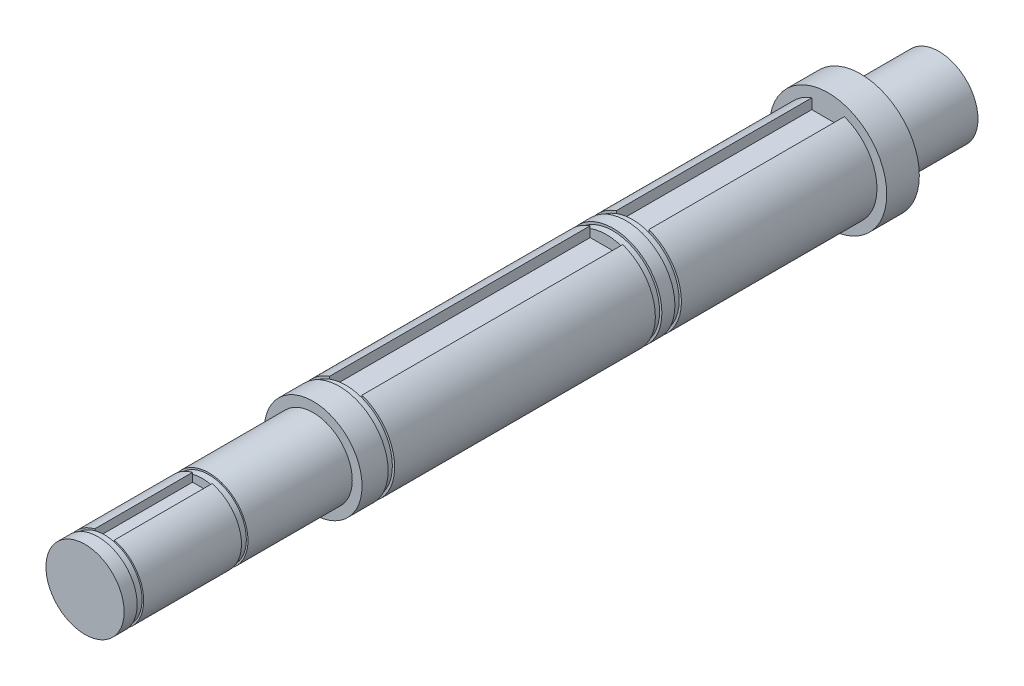
ISO-10303-21;
HEADER;
FILE_DESCRIPTION(('STEP AP214'),'2;1');
FILE_NAME('part.step','',(''),(''),'','','');
FILE_SCHEMA(('AUTOMOTIVE_DESIGN { 1 0 10303 214 1 1 1 1 }'));
ENDSEC;
DATA;
#1=APPLICATION_CONTEXT('core data for automotive mechanical design processes');
#2=APPLICATION_PROTOCOL_DEFINITION('international standard','automotive_design',2000,#1);
#3=PRODUCT_CONTEXT('',#1,'mechanical');
#4=PRODUCT('Part','Part','',(#3));
#5=PRODUCT_RELATED_PRODUCT_CATEGORY('part','',(#4));
#6=PRODUCT_DEFINITION_FORMATION('','',#4);
#7=PRODUCT_DEFINITION_CONTEXT('part definition',#1,'design');
#8=PRODUCT_DEFINITION('design','',#6,#7);
#9=PRODUCT_DEFINITION_SHAPE('','',#8);
#10=(LENGTH_UNIT() NAMED_UNIT(*) SI_UNIT(.MILLI.,.METRE.));
#11=(NAMED_UNIT(*) PLANE_ANGLE_UNIT() SI_UNIT($,.RADIAN.));
#12=(NAMED_UNIT(*) SI_UNIT($,.STERADIAN.) SOLID_ANGLE_UNIT());
#13=UNCERTAINTY_MEASURE_WITH_UNIT(LENGTH_MEASURE(1.E-05),#10,'distance_accuracy_value','');
#14=(GEOMETRIC_REPRESENTATION_CONTEXT(3) GLOBAL_UNCERTAINTY_ASSIGNED_CONTEXT((#13)) GLOBAL_UNIT_ASSIGNED_CONTEXT((#10,
#11,#12)) REPRESENTATION_CONTEXT('',''));
#15=CARTESIAN_POINT('',(0.,0.,0.));
#16=DIRECTION('',(0.,0.,1.));
#17=DIRECTION('',(1.,0.,0.));
#18=AXIS2_PLACEMENT_3D('',#15,#16,#17);
#19=CARTESIAN_POINT('',(0.,0.,0.));
#20=DIRECTION('',(0.,0.,1.));
#21=DIRECTION('',(1.,0.,0.));
#22=AXIS2_PLACEMENT_3D('',#19,#20,#21);
#23=CYLINDRICAL_SURFACE('',#22,6.);
#24=CARTESIAN_POINT('',(0.,0.,-12.));
#25=DIRECTION('',(0.,0.,1.));
#26=DIRECTION('',(1.,0.,0.));
#27=AXIS2_PLACEMENT_3D('',#24,#25,#26);
#28=CIRCLE('',#27,6.);
#29=CARTESIAN_POINT('',(6.,0.,-12.));
#30=VERTEX_POINT('',#29);
#31=EDGE_CURVE('E371',#30,#30,#28,.T.);
#32=ORIENTED_EDGE('',*,*,#31,.T.);
#33=EDGE_LOOP('',(#32));
#34=FACE_BOUND('',#33,.T.);
#35=CARTESIAN_POINT('',(0.,0.,4.));
#36=DIRECTION('',(0.,0.,1.));
#37=DIRECTION('',(1.,0.,0.));
#38=AXIS2_PLACEMENT_3D('',#35,#36,#37);
#39=CIRCLE('',#38,6.);
#40=CARTESIAN_POINT('',(6.,0.,4.));
#41=VERTEX_POINT('',#40);
#42=EDGE_CURVE('E58',#41,#41,#39,.T.);
#43=ORIENTED_EDGE('',*,*,#42,.F.);
#44=EDGE_LOOP('',(#43));
#45=FACE_BOUND('',#44,.T.);
#46=ADVANCED_FACE('F54',(#34,#45),#23,.T.);
#47=CARTESIAN_POINT('',(0.,0.,-57.));
#48=DIRECTION('',(0.,0.,1.));
#49=DIRECTION('',(1.,0.,0.));
#50=AXIS2_PLACEMENT_3D('',#47,#48,#49);
#51=PLANE('',#50);
#52=DIRECTION('',(0.,1.,0.));
#53=VECTOR('',#52,1.);
#54=CARTESIAN_POINT('',(2.5,5.5,-57.));
#55=LINE('',#54,#53);
#56=CARTESIAN_POINT('',(2.5,5.5,-57.));
#57=VERTEX_POINT('',#56);
#58=CARTESIAN_POINT('',(2.5,6.69869390254548,-57.));
#59=VERTEX_POINT('',#58);
#60=EDGE_CURVE('E297',#57,#59,#55,.T.);
#61=ORIENTED_EDGE('',*,*,#60,.T.);
#62=CARTESIAN_POINT('',(0.,0.,-57.));
#63=DIRECTION('',(0.,0.,1.));
#64=DIRECTION('',(1.,0.,0.));
#65=AXIS2_PLACEMENT_3D('',#62,#63,#64);
#66=CIRCLE('',#65,7.15);
#67=CARTESIAN_POINT('',(-2.5,6.69869390254548,-57.));
#68=VERTEX_POINT('',#67);
#69=EDGE_CURVE('E284',#59,#68,#66,.T.);
#70=ORIENTED_EDGE('',*,*,#69,.T.);
#71=DIRECTION('',(0.,-1.,0.));
#72=VECTOR('',#71,1.);
#73=CARTESIAN_POINT('',(-2.5,5.5,-57.));
#74=LINE('',#73,#72);
#75=CARTESIAN_POINT('',(-2.5,5.5,-57.));
#76=VERTEX_POINT('',#75);
#77=EDGE_CURVE('E301',#68,#76,#74,.T.);
#78=ORIENTED_EDGE('',*,*,#77,.T.);
#79=DIRECTION('',(1.,0.,0.));
#80=VECTOR('',#79,1.);
#81=CARTESIAN_POINT('',(2.5,5.5,-57.));
#82=LINE('',#81,#80);
#83=EDGE_CURVE('E306',#76,#57,#82,.T.);
#84=ORIENTED_EDGE('',*,*,#83,.T.);
#85=EDGE_LOOP('',(#61,#70,#78,#84));
#86=FACE_BOUND('',#85,.T.);
#87=ADVANCED_FACE('F513',(#86),#51,.T.);
#88=CARTESIAN_POINT('',(0.,0.,0.));
#89=DIRECTION('',(0.,0.,1.));
#90=DIRECTION('',(1.,0.,0.));
#91=AXIS2_PLACEMENT_3D('',#88,#89,#90);
#92=CYLINDRICAL_SURFACE('',#91,7.5);
#93=DIRECTION('',(0.,0.,1.));
#94=VECTOR('',#93,1.);
#95=CARTESIAN_POINT('',(-2.5,7.07106781186548,0.));
#96=LINE('',#95,#94);
#97=CARTESIAN_POINT('',(-2.5,7.07106781186548,-17.));
#98=VERTEX_POINT('',#97);
#99=CARTESIAN_POINT('',(-2.5,7.07106781186548,-57.));
#100=VERTEX_POINT('',#99);
#101=EDGE_CURVE('E326',#98,#100,#96,.F.);
#102=ORIENTED_EDGE('',*,*,#101,.T.);
#103=CARTESIAN_POINT('',(0.,0.,-57.));
#104=DIRECTION('',(0.,0.,1.));
#105=DIRECTION('',(1.,0.,0.));
#106=AXIS2_PLACEMENT_3D('',#103,#104,#105);
#107=CIRCLE('',#106,7.5);
#108=CARTESIAN_POINT('',(2.5,7.07106781186548,-57.));
#109=VERTEX_POINT('',#108);
#110=EDGE_CURVE('E283',#100,#109,#107,.T.);
#111=ORIENTED_EDGE('',*,*,#110,.T.);
#112=DIRECTION('',(0.,0.,1.));
#113=VECTOR('',#112,1.);
#114=CARTESIAN_POINT('',(2.5,7.07106781186548,0.));
#115=LINE('',#114,#113);
#116=CARTESIAN_POINT('',(2.5,7.07106781186548,-17.));
#117=VERTEX_POINT('',#116);
#118=EDGE_CURVE('E333',#109,#117,#115,.T.);
#119=ORIENTED_EDGE('',*,*,#118,.T.);
#120=CARTESIAN_POINT('',(0.,0.,-17.));
#121=DIRECTION('',(0.,0.,1.));
#122=DIRECTION('',(1.,0.,0.));
#123=AXIS2_PLACEMENT_3D('',#120,#121,#122);
#124=CIRCLE('',#123,7.5);
#125=EDGE_CURVE('E352',#98,#117,#124,.T.);
#126=ORIENTED_EDGE('',*,*,#125,.F.);
#127=EDGE_LOOP('',(#102,#111,#119,#126));
#128=FACE_BOUND('',#127,.T.);
#129=ADVANCED_FACE('F519',(#128),#92,.T.);
#130=CARTESIAN_POINT('',(0.,0.,-17.));
#131=DIRECTION('',(0.,0.,1.));
#132=DIRECTION('',(1.,0.,0.));
#133=AXIS2_PLACEMENT_3D('',#130,#131,#132);
#134=PLANE('',#133);
#135=DIRECTION('',(0.,1.,0.));
#136=VECTOR('',#135,1.);
#137=CARTESIAN_POINT('',(2.5,5.5,-17.));
#138=LINE('',#137,#136);
#139=CARTESIAN_POINT('',(2.5,6.69869390254548,-17.));
#140=VERTEX_POINT('',#139);
#141=EDGE_CURVE('E316',#140,#117,#138,.T.);
#142=ORIENTED_EDGE('',*,*,#141,.F.);
#143=CARTESIAN_POINT('',(0.,0.,-17.));
#144=DIRECTION('',(0.,0.,1.));
#145=DIRECTION('',(1.,0.,0.));
#146=AXIS2_PLACEMENT_3D('',#143,#144,#145);
#147=CIRCLE('',#146,7.15);
#148=CARTESIAN_POINT('',(-2.5,6.69869390254548,-17.));
#149=VERTEX_POINT('',#148);
#150=EDGE_CURVE('E343',#149,#140,#147,.T.);
#151=ORIENTED_EDGE('',*,*,#150,.F.);
#152=DIRECTION('',(0.,-1.,0.));
#153=VECTOR('',#152,1.);
#154=CARTESIAN_POINT('',(-2.5,5.5,-17.));
#155=LINE('',#154,#153);
#156=EDGE_CURVE('E319',#98,#149,#155,.T.);
#157=ORIENTED_EDGE('',*,*,#156,.F.);
#158=ORIENTED_EDGE('',*,*,#125,.T.);
#159=EDGE_LOOP('',(#142,#151,#157,#158));
#160=FACE_BOUND('',#159,.T.);
#161=ADVANCED_FACE('F593',(#160),#134,.T.);
#162=CARTESIAN_POINT('',(0.,0.,-16.));
#163=DIRECTION('',(0.,0.,1.));
#164=DIRECTION('',(1.,0.,0.));
#165=AXIS2_PLACEMENT_3D('',#162,#163,#164);
#166=PLANE('',#165);
#167=CARTESIAN_POINT('',(0.,0.,-16.));
#168=DIRECTION('',(0.,0.,1.));
#169=DIRECTION('',(1.,0.,0.));
#170=AXIS2_PLACEMENT_3D('',#167,#168,#169);
#171=CIRCLE('',#170,7.15);
#172=CARTESIAN_POINT('',(7.15,0.,-16.));
#173=VERTEX_POINT('',#172);
#174=EDGE_CURVE('E337',#173,#173,#171,.T.);
#175=ORIENTED_EDGE('',*,*,#174,.T.);
#176=EDGE_LOOP('',(#175));
#177=FACE_BOUND('',#176,.T.);
#178=CARTESIAN_POINT('',(0.,0.,-16.));
#179=DIRECTION('',(0.,0.,1.));
#180=DIRECTION('',(1.,0.,0.));
#181=AXIS2_PLACEMENT_3D('',#178,#179,#180);
#182=CIRCLE('',#181,7.5);
#183=CARTESIAN_POINT('',(7.5,0.,-16.));
#184=VERTEX_POINT('',#183);
#185=EDGE_CURVE('E342',#184,#184,#182,.T.);
#186=ORIENTED_EDGE('',*,*,#185,.F.);
#187=EDGE_LOOP('',(#186));
#188=FACE_BOUND('',#187,.T.);
#189=ADVANCED_FACE('F591',(#177,#188),#166,.F.);
#190=CARTESIAN_POINT('',(0.,0.,-17.));
#191=DIRECTION('',(0.,0.,1.));
#192=DIRECTION('',(1.,0.,0.));
#193=AXIS2_PLACEMENT_3D('',#190,#191,#192);
#194=CYLINDRICAL_SURFACE('',#193,7.15);
#195=EDGE_CURVE('E338',#140,#149,#147,.T.);
#196=ORIENTED_EDGE('',*,*,#195,.T.);
#197=ORIENTED_EDGE('',*,*,#150,.T.);
#198=EDGE_LOOP('',(#196,#197));
#199=FACE_BOUND('',#198,.T.);
#200=ORIENTED_EDGE('',*,*,#174,.F.);
#201=EDGE_LOOP('',(#200));
#202=FACE_BOUND('',#201,.T.);
#203=ADVANCED_FACE('F587',(#199,#202),#194,.T.);
#204=CARTESIAN_POINT('',(0.,6.,-12.));
#205=DIRECTION('',(0.,0.,-1.));
#206=DIRECTION('',(-1.,0.,0.));
#207=AXIS2_PLACEMENT_3D('',#204,#205,#206);
#208=PLANE('',#207);
#209=ORIENTED_EDGE('',*,*,#31,.F.);
#210=EDGE_LOOP('',(#209));
#211=FACE_BOUND('',#210,.T.);
#212=CARTESIAN_POINT('',(0.,0.,-12.));
#213=DIRECTION('',(0.,0.,1.));
#214=DIRECTION('',(1.,0.,0.));
#215=AXIS2_PLACEMENT_3D('',#212,#213,#214);
#216=CIRCLE('',#215,7.5);
#217=CARTESIAN_POINT('',(7.5,0.,-12.));
#218=VERTEX_POINT('',#217);
#219=EDGE_CURVE('E367',#218,#218,#216,.T.);
#220=ORIENTED_EDGE('',*,*,#219,.T.);
#221=EDGE_LOOP('',(#220));
#222=FACE_BOUND('',#221,.T.);
#223=ADVANCED_FACE('F590',(#211,#222),#208,.F.);
#224=ORIENTED_EDGE('',*,*,#185,.T.);
#225=EDGE_LOOP('',(#224));
#226=FACE_BOUND('',#225,.T.);
#227=ORIENTED_EDGE('',*,*,#219,.F.);
#228=EDGE_LOOP('',(#227));
#229=FACE_BOUND('',#228,.T.);
#230=ADVANCED_FACE('F585',(#226,#229),#92,.T.);
#231=CARTESIAN_POINT('',(2.5,5.5,-57.));
#232=DIRECTION('',(1.,0.,0.));
#233=DIRECTION('',(0.,0.,-1.));
#234=AXIS2_PLACEMENT_3D('',#231,#232,#233);
#235=PLANE('',#234);
#236=ORIENTED_EDGE('',*,*,#60,.F.);
#237=DIRECTION('',(0.,0.,1.));
#238=VECTOR('',#237,1.);
#239=CARTESIAN_POINT('',(2.5,5.5,-57.));
#240=LINE('',#239,#238);
#241=CARTESIAN_POINT('',(2.5,5.5,-17.));
#242=VERTEX_POINT('',#241);
#243=EDGE_CURVE('E323',#57,#242,#240,.T.);
#244=ORIENTED_EDGE('',*,*,#243,.T.);
#245=EDGE_CURVE('E311',#242,#140,#138,.T.);
#246=ORIENTED_EDGE('',*,*,#245,.T.);
#247=ORIENTED_EDGE('',*,*,#141,.T.);
#248=ORIENTED_EDGE('',*,*,#118,.F.);
#249=DIRECTION('',(0.,-1.,0.));
#250=VECTOR('',#249,1.);
#251=CARTESIAN_POINT('',(2.5,5.5,-57.));
#252=LINE('',#251,#250);
#253=EDGE_CURVE('E292',#109,#59,#252,.T.);
#254=ORIENTED_EDGE('',*,*,#253,.T.);
#255=EDGE_LOOP('',(#236,#244,#246,#247,#248,#254));
#256=FACE_BOUND('',#255,.T.);
#257=ADVANCED_FACE('F581',(#256),#235,.F.);
#258=CARTESIAN_POINT('',(-2.5,5.5,-57.));
#259=DIRECTION('',(-1.,0.,0.));
#260=DIRECTION('',(0.,0.,1.));
#261=AXIS2_PLACEMENT_3D('',#258,#259,#260);
#262=PLANE('',#261);
#263=ORIENTED_EDGE('',*,*,#156,.T.);
#264=CARTESIAN_POINT('',(-2.5,5.5,-17.));
#265=VERTEX_POINT('',#264);
#266=EDGE_CURVE('E315',#149,#265,#155,.T.);
#267=ORIENTED_EDGE('',*,*,#266,.T.);
#268=DIRECTION('',(0.,0.,1.));
#269=VECTOR('',#268,1.);
#270=CARTESIAN_POINT('',(-2.5,5.5,-57.));
#271=LINE('',#270,#269);
#272=EDGE_CURVE('E310',#76,#265,#271,.T.);
#273=ORIENTED_EDGE('',*,*,#272,.F.);
#274=ORIENTED_EDGE('',*,*,#77,.F.);
#275=EDGE_CURVE('E303',#100,#68,#74,.T.);
#276=ORIENTED_EDGE('',*,*,#275,.F.);
#277=ORIENTED_EDGE('',*,*,#101,.F.);
#278=EDGE_LOOP('',(#263,#267,#273,#274,#276,#277));
#279=FACE_BOUND('',#278,.T.);
#280=ADVANCED_FACE('F577',(#279),#262,.F.);
#281=CARTESIAN_POINT('',(2.5,5.5,-57.));
#282=DIRECTION('',(0.,-1.,0.));
#283=DIRECTION('',(0.,0.,-1.));
#284=AXIS2_PLACEMENT_3D('',#281,#282,#283);
#285=PLANE('',#284);
#286=DIRECTION('',(1.,0.,0.));
#287=VECTOR('',#286,1.);
#288=CARTESIAN_POINT('',(2.5,5.5,-17.));
#289=LINE('',#288,#287);
#290=EDGE_CURVE('E302',#265,#242,#289,.T.);
#291=ORIENTED_EDGE('',*,*,#290,.T.);
#292=ORIENTED_EDGE('',*,*,#243,.F.);
#293=ORIENTED_EDGE('',*,*,#83,.F.);
#294=ORIENTED_EDGE('',*,*,#272,.T.);
#295=EDGE_LOOP('',(#291,#292,#293,#294));
#296=FACE_BOUND('',#295,.T.);
#297=ADVANCED_FACE('F573',(#296),#285,.F.);
#298=CARTESIAN_POINT('',(0.,0.,-17.));
#299=DIRECTION('',(0.,0.,1.));
#300=DIRECTION('',(1.,0.,0.));
#301=AXIS2_PLACEMENT_3D('',#298,#299,#300);
#302=PLANE('',#301);
#303=ORIENTED_EDGE('',*,*,#195,.F.);
#304=ORIENTED_EDGE('',*,*,#245,.F.);
#305=ORIENTED_EDGE('',*,*,#290,.F.);
#306=ORIENTED_EDGE('',*,*,#266,.F.);
#307=EDGE_LOOP('',(#303,#304,#305,#306));
#308=FACE_BOUND('',#307,.T.);
#309=ADVANCED_FACE('F566',(#308),#302,.F.);
#310=CARTESIAN_POINT('',(0.,0.,-58.));
#311=DIRECTION('',(0.,0.,1.));
#312=DIRECTION('',(1.,0.,0.));
#313=AXIS2_PLACEMENT_3D('',#310,#311,#312);
#314=PLANE('',#313);
#315=CARTESIAN_POINT('',(0.,0.,-58.));
#316=DIRECTION('',(0.,0.,1.));
#317=DIRECTION('',(1.,0.,0.));
#318=AXIS2_PLACEMENT_3D('',#315,#316,#317);
#319=CIRCLE('',#318,7.15);
#320=CARTESIAN_POINT('',(7.15,0.,-58.));
#321=VERTEX_POINT('',#320);
#322=EDGE_CURVE('E279',#321,#321,#319,.T.);
#323=ORIENTED_EDGE('',*,*,#322,.F.);
#324=EDGE_LOOP('',(#323));
#325=FACE_BOUND('',#324,.T.);
#326=CARTESIAN_POINT('',(0.,0.,-58.));
#327=DIRECTION('',(0.,0.,1.));
#328=DIRECTION('',(1.,0.,0.));
#329=AXIS2_PLACEMENT_3D('',#326,#327,#328);
#330=CIRCLE('',#329,7.5);
#331=CARTESIAN_POINT('',(7.5,0.,-58.));
#332=VERTEX_POINT('',#331);
#333=EDGE_CURVE('E296',#332,#332,#330,.T.);
#334=ORIENTED_EDGE('',*,*,#333,.T.);
#335=EDGE_LOOP('',(#334));
#336=FACE_BOUND('',#335,.T.);
#337=ADVANCED_FACE('F563',(#325,#336),#314,.T.);
#338=CARTESIAN_POINT('',(0.,0.,-57.));
#339=DIRECTION('',(0.,0.,1.));
#340=DIRECTION('',(1.,0.,0.));
#341=AXIS2_PLACEMENT_3D('',#338,#339,#340);
#342=PLANE('',#341);
#343=ORIENTED_EDGE('',*,*,#110,.F.);
#344=ORIENTED_EDGE('',*,*,#275,.T.);
#345=EDGE_CURVE('E288',#68,#59,#66,.T.);
#346=ORIENTED_EDGE('',*,*,#345,.T.);
#347=ORIENTED_EDGE('',*,*,#253,.F.);
#348=EDGE_LOOP('',(#343,#344,#346,#347));
#349=FACE_BOUND('',#348,.T.);
#350=ADVANCED_FACE('F561',(#349),#342,.F.);
#351=CARTESIAN_POINT('',(0.,0.,-58.));
#352=DIRECTION('',(0.,0.,1.));
#353=DIRECTION('',(1.,0.,0.));
#354=AXIS2_PLACEMENT_3D('',#351,#352,#353);
#355=CYLINDRICAL_SURFACE('',#354,7.15);
#356=ORIENTED_EDGE('',*,*,#322,.T.);
#357=EDGE_LOOP('',(#356));
#358=FACE_BOUND('',#357,.T.);
#359=ORIENTED_EDGE('',*,*,#69,.F.);
#360=ORIENTED_EDGE('',*,*,#345,.F.);
#361=EDGE_LOOP('',(#359,#360));
#362=FACE_BOUND('',#361,.T.);
#363=ADVANCED_FACE('F558',(#358,#362),#355,.T.);
#364=CARTESIAN_POINT('',(0.,0.,-60.));
#365=DIRECTION('',(0.,0.,1.));
#366=DIRECTION('',(1.,0.,0.));
#367=AXIS2_PLACEMENT_3D('',#364,#365,#366);
#368=CIRCLE('',#367,7.5);
#369=CARTESIAN_POINT('',(7.5,0.,-60.));
#370=VERTEX_POINT('',#369);
#371=EDGE_CURVE('E274',#370,#370,#368,.T.);
#372=ORIENTED_EDGE('',*,*,#371,.T.);
#373=EDGE_LOOP('',(#372));
#374=FACE_BOUND('',#373,.T.);
#375=ORIENTED_EDGE('',*,*,#333,.F.);
#376=EDGE_LOOP('',(#375));
#377=FACE_BOUND('',#376,.T.);
#378=ADVANCED_FACE('F554',(#374,#377),#92,.T.);
#379=CARTESIAN_POINT('',(0.,0.,-61.));
#380=DIRECTION('',(0.,0.,1.));
#381=DIRECTION('',(1.,0.,0.));
#382=AXIS2_PLACEMENT_3D('',#379,#380,#381);
#383=PLANE('',#382);
#384=DIRECTION('',(0.,1.,0.));
#385=VECTOR('',#384,1.);
#386=CARTESIAN_POINT('',(2.5,5.5,-61.));
#387=LINE('',#386,#385);
#388=CARTESIAN_POINT('',(2.5,6.69869390254548,-61.));
#389=VERTEX_POINT('',#388);
#390=CARTESIAN_POINT('',(2.5,7.07106781186548,-61.));
#391=VERTEX_POINT('',#390);
#392=EDGE_CURVE('E240',#389,#391,#387,.T.);
#393=ORIENTED_EDGE('',*,*,#392,.F.);
#394=CARTESIAN_POINT('',(0.,0.,-61.));
#395=DIRECTION('',(0.,0.,1.));
#396=DIRECTION('',(1.,0.,0.));
#397=AXIS2_PLACEMENT_3D('',#394,#395,#396);
#398=CIRCLE('',#397,7.15);
#399=CARTESIAN_POINT('',(-2.5,6.69869390254548,-61.));
#400=VERTEX_POINT('',#399);
#401=EDGE_CURVE('E275',#400,#389,#398,.T.);
#402=ORIENTED_EDGE('',*,*,#401,.F.);
#403=DIRECTION('',(0.,-1.,0.));
#404=VECTOR('',#403,1.);
#405=CARTESIAN_POINT('',(-2.5,5.5,-61.));
#406=LINE('',#405,#404);
#407=CARTESIAN_POINT('',(-2.5,7.07106781186548,-61.));
#408=VERTEX_POINT('',#407);
#409=EDGE_CURVE('E260',#408,#400,#406,.T.);
#410=ORIENTED_EDGE('',*,*,#409,.F.);
#411=CARTESIAN_POINT('',(0.,0.,-61.));
#412=DIRECTION('',(0.,0.,1.));
#413=DIRECTION('',(1.,0.,0.));
#414=AXIS2_PLACEMENT_3D('',#411,#412,#413);
#415=CIRCLE('',#414,7.5);
#416=EDGE_CURVE('E388',#408,#391,#415,.T.);
#417=ORIENTED_EDGE('',*,*,#416,.T.);
#418=EDGE_LOOP('',(#393,#402,#410,#417));
#419=FACE_BOUND('',#418,.T.);
#420=ADVANCED_FACE('F460',(#419),#383,.T.);
#421=CARTESIAN_POINT('',(0.,0.,-60.));
#422=DIRECTION('',(0.,0.,1.));
#423=DIRECTION('',(1.,0.,0.));
#424=AXIS2_PLACEMENT_3D('',#421,#422,#423);
#425=PLANE('',#424);
#426=CARTESIAN_POINT('',(0.,0.,-60.));
#427=DIRECTION('',(0.,0.,1.));
#428=DIRECTION('',(1.,0.,0.));
#429=AXIS2_PLACEMENT_3D('',#426,#427,#428);
#430=CIRCLE('',#429,7.15);
#431=CARTESIAN_POINT('',(7.15,0.,-60.));
#432=VERTEX_POINT('',#431);
#433=EDGE_CURVE('E266',#432,#432,#430,.T.);
#434=ORIENTED_EDGE('',*,*,#433,.T.);
#435=EDGE_LOOP('',(#434));
#436=FACE_BOUND('',#435,.T.);
#437=ORIENTED_EDGE('',*,*,#371,.F.);
#438=EDGE_LOOP('',(#437));
#439=FACE_BOUND('',#438,.T.);
#440=ADVANCED_FACE('F509',(#436,#439),#425,.F.);
#441=CARTESIAN_POINT('',(0.,0.,-61.));
#442=DIRECTION('',(0.,0.,1.));
#443=DIRECTION('',(1.,0.,0.));
#444=AXIS2_PLACEMENT_3D('',#441,#442,#443);
#445=CYLINDRICAL_SURFACE('',#444,7.15);
#446=EDGE_CURVE('E270',#389,#400,#398,.T.);
#447=ORIENTED_EDGE('',*,*,#446,.T.);
#448=ORIENTED_EDGE('',*,*,#401,.T.);
#449=EDGE_LOOP('',(#447,#448));
#450=FACE_BOUND('',#449,.T.);
#451=ORIENTED_EDGE('',*,*,#433,.F.);
#452=EDGE_LOOP('',(#451));
#453=FACE_BOUND('',#452,.T.);
#454=ADVANCED_FACE('F463',(#450,#453),#445,.T.);
#455=CARTESIAN_POINT('',(0.,6.,-108.));
#456=DIRECTION('',(0.,0.,1.));
#457=DIRECTION('',(1.,0.,0.));
#458=AXIS2_PLACEMENT_3D('',#455,#456,#457);
#459=PLANE('',#458);
#460=CARTESIAN_POINT('',(0.,0.,-108.));
#461=DIRECTION('',(0.,0.,1.));
#462=DIRECTION('',(1.,0.,0.));
#463=AXIS2_PLACEMENT_3D('',#460,#461,#462);
#464=CIRCLE('',#463,6.);
#465=CARTESIAN_POINT('',(6.,0.,-108.));
#466=VERTEX_POINT('',#465);
#467=EDGE_CURVE('E347',#466,#466,#464,.T.);
#468=ORIENTED_EDGE('',*,*,#467,.F.);
#469=EDGE_LOOP('',(#468));
#470=FACE_BOUND('',#469,.T.);
#471=ADVANCED_FACE('F500',(#470),#459,.F.);
#472=CARTESIAN_POINT('',(0.,0.,0.));
#473=DIRECTION('',(0.,0.,1.));
#474=DIRECTION('',(1.,0.,0.));
#475=AXIS2_PLACEMENT_3D('',#472,#473,#474);
#476=CYLINDRICAL_SURFACE('',#475,6.);
#477=CARTESIAN_POINT('',(0.,0.,-96.));
#478=DIRECTION('',(0.,0.,1.));
#479=DIRECTION('',(1.,0.,0.));
#480=AXIS2_PLACEMENT_3D('',#477,#478,#479);
#481=CIRCLE('',#480,6.);
#482=CARTESIAN_POINT('',(6.,0.,-96.));
#483=VERTEX_POINT('',#482);
#484=EDGE_CURVE('E351',#483,#483,#481,.T.);
#485=ORIENTED_EDGE('',*,*,#484,.F.);
#486=EDGE_LOOP('',(#485));
#487=FACE_BOUND('',#486,.T.);
#488=ORIENTED_EDGE('',*,*,#467,.T.);
#489=EDGE_LOOP('',(#488));
#490=FACE_BOUND('',#489,.T.);
#491=ADVANCED_FACE('F494',(#487,#490),#476,.T.);
#492=CARTESIAN_POINT('',(0.,9.,-96.));
#493=DIRECTION('',(0.,0.,1.));
#494=DIRECTION('',(1.,0.,0.));
#495=AXIS2_PLACEMENT_3D('',#492,#493,#494);
#496=PLANE('',#495);
#497=CARTESIAN_POINT('',(0.,0.,-96.));
#498=DIRECTION('',(0.,0.,1.));
#499=DIRECTION('',(1.,0.,0.));
#500=AXIS2_PLACEMENT_3D('',#497,#498,#499);
#501=CIRCLE('',#500,9.);
#502=CARTESIAN_POINT('',(9.,0.,-96.));
#503=VERTEX_POINT('',#502);
#504=EDGE_CURVE('E356',#503,#503,#501,.T.);
#505=ORIENTED_EDGE('',*,*,#504,.F.);
#506=EDGE_LOOP('',(#505));
#507=FACE_BOUND('',#506,.T.);
#508=ORIENTED_EDGE('',*,*,#484,.T.);
#509=EDGE_LOOP('',(#508));
#510=FACE_BOUND('',#509,.T.);
#511=ADVANCED_FACE('F488',(#507,#510),#496,.F.);
#512=CARTESIAN_POINT('',(0.,0.,0.));
#513=DIRECTION('',(0.,0.,1.));
#514=DIRECTION('',(1.,0.,0.));
#515=AXIS2_PLACEMENT_3D('',#512,#513,#514);
#516=CYLINDRICAL_SURFACE('',#515,9.);
#517=CARTESIAN_POINT('',(0.,0.,-91.));
#518=DIRECTION('',(0.,0.,1.));
#519=DIRECTION('',(1.,0.,0.));
#520=AXIS2_PLACEMENT_3D('',#517,#518,#519);
#521=CIRCLE('',#520,9.);
#522=CARTESIAN_POINT('',(9.,0.,-91.));
#523=VERTEX_POINT('',#522);
#524=EDGE_CURVE('E360',#523,#523,#521,.T.);
#525=ORIENTED_EDGE('',*,*,#524,.F.);
#526=EDGE_LOOP('',(#525));
#527=FACE_BOUND('',#526,.T.);
#528=ORIENTED_EDGE('',*,*,#504,.T.);
#529=EDGE_LOOP('',(#528));
#530=FACE_BOUND('',#529,.T.);
#531=ADVANCED_FACE('F482',(#527,#530),#516,.T.);
#532=CARTESIAN_POINT('',(0.,7.5,-91.));
#533=DIRECTION('',(0.,0.,-1.));
#534=DIRECTION('',(-1.,0.,0.));
#535=AXIS2_PLACEMENT_3D('',#532,#533,#534);
#536=PLANE('',#535);
#537=DIRECTION('',(0.,1.,0.));
#538=VECTOR('',#537,1.);
#539=CARTESIAN_POINT('',(2.5,5.5,-91.));
#540=LINE('',#539,#538);
#541=CARTESIAN_POINT('',(2.5,5.5,-91.));
#542=VERTEX_POINT('',#541);
#543=CARTESIAN_POINT('',(2.5,7.07106781186548,-91.));
#544=VERTEX_POINT('',#543);
#545=EDGE_CURVE('E241',#542,#544,#540,.T.);
#546=ORIENTED_EDGE('',*,*,#545,.T.);
#547=CARTESIAN_POINT('',(0.,0.,-91.));
#548=DIRECTION('',(0.,0.,1.));
#549=DIRECTION('',(1.,0.,0.));
#550=AXIS2_PLACEMENT_3D('',#547,#548,#549);
#551=CIRCLE('',#550,7.5);
#552=CARTESIAN_POINT('',(-2.5,7.07106781186548,-91.));
#553=VERTEX_POINT('',#552);
#554=EDGE_CURVE('E363',#553,#544,#551,.T.);
#555=ORIENTED_EDGE('',*,*,#554,.F.);
#556=DIRECTION('',(0.,-1.,0.));
#557=VECTOR('',#556,1.);
#558=CARTESIAN_POINT('',(-2.5,5.5,-91.));
#559=LINE('',#558,#557);
#560=CARTESIAN_POINT('',(-2.5,5.5,-91.));
#561=VERTEX_POINT('',#560);
#562=EDGE_CURVE('E244',#553,#561,#559,.T.);
#563=ORIENTED_EDGE('',*,*,#562,.T.);
#564=DIRECTION('',(1.,0.,0.));
#565=VECTOR('',#564,1.);
#566=CARTESIAN_POINT('',(2.5,5.5,-91.));
#567=LINE('',#566,#565);
#568=EDGE_CURVE('E248',#561,#542,#567,.T.);
#569=ORIENTED_EDGE('',*,*,#568,.T.);
#570=EDGE_LOOP('',(#546,#555,#563,#569));
#571=FACE_BOUND('',#570,.T.);
#572=ORIENTED_EDGE('',*,*,#524,.T.);
#573=EDGE_LOOP('',(#572));
#574=FACE_BOUND('',#573,.T.);
#575=ADVANCED_FACE('F479',(#571,#574),#536,.F.);
#576=ORIENTED_EDGE('',*,*,#554,.T.);
#577=DIRECTION('',(0.,0.,1.));
#578=VECTOR('',#577,1.);
#579=CARTESIAN_POINT('',(2.5,7.07106781186548,0.));
#580=LINE('',#579,#578);
#581=EDGE_CURVE('E395',#544,#391,#580,.T.);
#582=ORIENTED_EDGE('',*,*,#581,.T.);
#583=ORIENTED_EDGE('',*,*,#416,.F.);
#584=DIRECTION('',(0.,0.,1.));
#585=VECTOR('',#584,1.);
#586=CARTESIAN_POINT('',(-2.5,7.07106781186548,0.));
#587=LINE('',#586,#585);
#588=EDGE_CURVE('E375',#408,#553,#587,.F.);
#589=ORIENTED_EDGE('',*,*,#588,.T.);
#590=EDGE_LOOP('',(#576,#582,#583,#589));
#591=FACE_BOUND('',#590,.T.);
#592=ADVANCED_FACE('F478',(#591),#92,.T.);
#593=CARTESIAN_POINT('',(2.5,5.5,-91.));
#594=DIRECTION('',(1.,0.,0.));
#595=DIRECTION('',(0.,0.,-1.));
#596=AXIS2_PLACEMENT_3D('',#593,#594,#595);
#597=PLANE('',#596);
#598=ORIENTED_EDGE('',*,*,#545,.F.);
#599=DIRECTION('',(0.,0.,1.));
#600=VECTOR('',#599,1.);
#601=CARTESIAN_POINT('',(2.5,5.5,-91.));
#602=LINE('',#601,#600);
#603=CARTESIAN_POINT('',(2.5,5.5,-61.));
#604=VERTEX_POINT('',#603);
#605=EDGE_CURVE('E263',#542,#604,#602,.T.);
#606=ORIENTED_EDGE('',*,*,#605,.T.);
#607=EDGE_CURVE('E253',#604,#389,#387,.T.);
#608=ORIENTED_EDGE('',*,*,#607,.T.);
#609=ORIENTED_EDGE('',*,*,#392,.T.);
#610=ORIENTED_EDGE('',*,*,#581,.F.);
#611=EDGE_LOOP('',(#598,#606,#608,#609,#610));
#612=FACE_BOUND('',#611,.T.);
#613=ADVANCED_FACE('F471',(#612),#597,.F.);
#614=CARTESIAN_POINT('',(-2.5,5.5,-91.));
#615=DIRECTION('',(-1.,0.,0.));
#616=DIRECTION('',(0.,0.,1.));
#617=AXIS2_PLACEMENT_3D('',#614,#615,#616);
#618=PLANE('',#617);
#619=ORIENTED_EDGE('',*,*,#409,.T.);
#620=CARTESIAN_POINT('',(-2.5,5.5,-61.));
#621=VERTEX_POINT('',#620);
#622=EDGE_CURVE('E257',#400,#621,#406,.T.);
#623=ORIENTED_EDGE('',*,*,#622,.T.);
#624=DIRECTION('',(0.,0.,1.));
#625=VECTOR('',#624,1.);
#626=CARTESIAN_POINT('',(-2.5,5.5,-91.));
#627=LINE('',#626,#625);
#628=EDGE_CURVE('E252',#561,#621,#627,.T.);
#629=ORIENTED_EDGE('',*,*,#628,.F.);
#630=ORIENTED_EDGE('',*,*,#562,.F.);
#631=ORIENTED_EDGE('',*,*,#588,.F.);
#632=EDGE_LOOP('',(#619,#623,#629,#630,#631));
#633=FACE_BOUND('',#632,.T.);
#634=ADVANCED_FACE('F454',(#633),#618,.F.);
#635=CARTESIAN_POINT('',(0.,0.,-61.));
#636=DIRECTION('',(0.,0.,1.));
#637=DIRECTION('',(1.,0.,0.));
#638=AXIS2_PLACEMENT_3D('',#635,#636,#637);
#639=PLANE('',#638);
#640=ORIENTED_EDGE('',*,*,#446,.F.);
#641=ORIENTED_EDGE('',*,*,#607,.F.);
#642=DIRECTION('',(1.,0.,0.));
#643=VECTOR('',#642,1.);
#644=CARTESIAN_POINT('',(2.5,5.5,-61.));
#645=LINE('',#644,#643);
#646=EDGE_CURVE('E245',#621,#604,#645,.T.);
#647=ORIENTED_EDGE('',*,*,#646,.F.);
#648=ORIENTED_EDGE('',*,*,#622,.F.);
#649=EDGE_LOOP('',(#640,#641,#647,#648));
#650=FACE_BOUND('',#649,.T.);
#651=ADVANCED_FACE('F467',(#650),#639,.F.);
#652=CARTESIAN_POINT('',(2.5,5.5,-91.));
#653=DIRECTION('',(0.,-1.,0.));
#654=DIRECTION('',(0.,0.,-1.));
#655=AXIS2_PLACEMENT_3D('',#652,#653,#654);
#656=PLANE('',#655);
#657=ORIENTED_EDGE('',*,*,#646,.T.);
#658=ORIENTED_EDGE('',*,*,#605,.F.);
#659=ORIENTED_EDGE('',*,*,#568,.F.);
#660=ORIENTED_EDGE('',*,*,#628,.T.);
#661=EDGE_LOOP('',(#657,#658,#659,#660));
#662=FACE_BOUND('',#661,.T.);
#663=ADVANCED_FACE('F430',(#662),#656,.F.);
#664=CARTESIAN_POINT('',(0.,0.,4.));
#665=DIRECTION('',(0.,0.,1.));
#666=DIRECTION('',(1.,0.,0.));
#667=AXIS2_PLACEMENT_3D('',#664,#665,#666);
#668=PLANE('',#667);
#669=CARTESIAN_POINT('',(0.,0.,4.));
#670=DIRECTION('',(0.,0.,1.));
#671=DIRECTION('',(1.,0.,0.));
#672=AXIS2_PLACEMENT_3D('',#669,#670,#671);
#673=CIRCLE('',#672,5.75);
#674=CARTESIAN_POINT('',(5.75,0.,4.));
#675=VERTEX_POINT('',#674);
#676=EDGE_CURVE('E201',#675,#675,#673,.T.);
#677=ORIENTED_EDGE('',*,*,#676,.F.);
#678=EDGE_LOOP('',(#677));
#679=FACE_BOUND('',#678,.T.);
#680=ORIENTED_EDGE('',*,*,#42,.T.);
#681=EDGE_LOOP('',(#680));
#682=FACE_BOUND('',#681,.T.);
#683=ADVANCED_FACE('F427',(#679,#682),#668,.T.);
#684=CARTESIAN_POINT('',(0.,0.,5.));
#685=DIRECTION('',(0.,0.,1.));
#686=DIRECTION('',(1.,0.,0.));
#687=AXIS2_PLACEMENT_3D('',#684,#685,#686);
#688=PLANE('',#687);
#689=CARTESIAN_POINT('',(0.,0.,5.));
#690=DIRECTION('',(0.,0.,1.));
#691=DIRECTION('',(1.,0.,0.));
#692=AXIS2_PLACEMENT_3D('',#689,#690,#691);
#693=CIRCLE('',#692,5.75);
#694=CARTESIAN_POINT('',(-1.5,5.55090082779363,5.));
#695=VERTEX_POINT('',#694);
#696=CARTESIAN_POINT('',(1.5,5.55090082779363,5.));
#697=VERTEX_POINT('',#696);
#698=EDGE_CURVE('E178',#695,#697,#693,.T.);
#699=ORIENTED_EDGE('',*,*,#698,.T.);
#700=DIRECTION('',(0.,1.,0.));
#701=VECTOR('',#700,1.);
#702=CARTESIAN_POINT('',(1.5,6.,5.));
#703=LINE('',#702,#701);
#704=CARTESIAN_POINT('',(1.5,5.80947501931113,5.));
#705=VERTEX_POINT('',#704);
#706=EDGE_CURVE('E220',#697,#705,#703,.T.);
#707=ORIENTED_EDGE('',*,*,#706,.T.);
#708=CARTESIAN_POINT('',(0.,0.,5.));
#709=DIRECTION('',(0.,0.,1.));
#710=DIRECTION('',(1.,0.,0.));
#711=AXIS2_PLACEMENT_3D('',#708,#709,#710);
#712=CIRCLE('',#711,6.);
#713=CARTESIAN_POINT('',(-1.5,5.80947501931113,5.));
#714=VERTEX_POINT('',#713);
#715=EDGE_CURVE('E181',#714,#705,#712,.T.);
#716=ORIENTED_EDGE('',*,*,#715,.F.);
#717=DIRECTION('',(0.,-1.,0.));
#718=VECTOR('',#717,1.);
#719=CARTESIAN_POINT('',(-1.5,6.,5.));
#720=LINE('',#719,#718);
#721=EDGE_CURVE('E176',#714,#695,#720,.T.);
#722=ORIENTED_EDGE('',*,*,#721,.T.);
#723=EDGE_LOOP('',(#699,#707,#716,#722));
#724=FACE_BOUND('',#723,.T.);
#725=ADVANCED_FACE('F177',(#724),#688,.F.);
#726=CARTESIAN_POINT('',(0.,0.,4.));
#727=DIRECTION('',(0.,0.,1.));
#728=DIRECTION('',(1.,0.,0.));
#729=AXIS2_PLACEMENT_3D('',#726,#727,#728);
#730=CYLINDRICAL_SURFACE('',#729,5.75);
#731=ORIENTED_EDGE('',*,*,#676,.T.);
#732=EDGE_LOOP('',(#731));
#733=FACE_BOUND('',#732,.T.);
#734=EDGE_CURVE('E71',#697,#695,#693,.T.);
#735=ORIENTED_EDGE('',*,*,#734,.F.);
#736=ORIENTED_EDGE('',*,*,#698,.F.);
#737=EDGE_LOOP('',(#735,#736));
#738=FACE_BOUND('',#737,.T.);
#739=ADVANCED_FACE('F190',(#733,#738),#730,.T.);
#740=CARTESIAN_POINT('',(0.,0.,23.));
#741=DIRECTION('',(0.,0.,1.));
#742=DIRECTION('',(1.,0.,0.));
#743=AXIS2_PLACEMENT_3D('',#740,#741,#742);
#744=PLANE('',#743);
#745=CARTESIAN_POINT('',(0.,0.,23.));
#746=DIRECTION('',(0.,0.,1.));
#747=DIRECTION('',(1.,0.,0.));
#748=AXIS2_PLACEMENT_3D('',#745,#746,#747);
#749=CIRCLE('',#748,6.);
#750=CARTESIAN_POINT('',(6.,0.,23.));
#751=VERTEX_POINT('',#750);
#752=EDGE_CURVE('E216',#751,#751,#749,.T.);
#753=ORIENTED_EDGE('',*,*,#752,.T.);
#754=EDGE_LOOP('',(#753));
#755=FACE_BOUND('',#754,.T.);
#756=ADVANCED_FACE('F524',(#755),#744,.T.);
#757=ORIENTED_EDGE('',*,*,#752,.F.);
#758=EDGE_LOOP('',(#757));
#759=FACE_BOUND('',#758,.T.);
#760=CARTESIAN_POINT('',(0.,0.,21.));
#761=DIRECTION('',(0.,0.,-1.));
#762=DIRECTION('',(-1.,0.,0.));
#763=AXIS2_PLACEMENT_3D('',#760,#761,#762);
#764=CIRCLE('',#763,6.);
#765=CARTESIAN_POINT('',(-6.,0.,21.));
#766=VERTEX_POINT('',#765);
#767=EDGE_CURVE('E398',#766,#766,#764,.T.);
#768=ORIENTED_EDGE('',*,*,#767,.F.);
#769=EDGE_LOOP('',(#768));
#770=FACE_BOUND('',#769,.T.);
#771=ADVANCED_FACE('F515',(#759,#770),#23,.T.);
#772=CARTESIAN_POINT('',(0.,0.,21.));
#773=DIRECTION('',(0.,0.,-1.));
#774=DIRECTION('',(-1.,0.,0.));
#775=AXIS2_PLACEMENT_3D('',#772,#773,#774);
#776=PLANE('',#775);
#777=CARTESIAN_POINT('',(0.,0.,21.));
#778=DIRECTION('',(0.,0.,-1.));
#779=DIRECTION('',(-1.,0.,0.));
#780=AXIS2_PLACEMENT_3D('',#777,#778,#779);
#781=CIRCLE('',#780,5.75);
#782=CARTESIAN_POINT('',(-5.75,0.,21.));
#783=VERTEX_POINT('',#782);
#784=EDGE_CURVE('E409',#783,#783,#781,.T.);
#785=ORIENTED_EDGE('',*,*,#784,.F.);
#786=EDGE_LOOP('',(#785));
#787=FACE_BOUND('',#786,.T.);
#788=ORIENTED_EDGE('',*,*,#767,.T.);
#789=EDGE_LOOP('',(#788));
#790=FACE_BOUND('',#789,.T.);
#791=ADVANCED_FACE('F523',(#787,#790),#776,.T.);
#792=CARTESIAN_POINT('',(0.,0.,21.));
#793=DIRECTION('',(0.,0.,-1.));
#794=DIRECTION('',(-1.,0.,0.));
#795=AXIS2_PLACEMENT_3D('',#792,#793,#794);
#796=CYLINDRICAL_SURFACE('',#795,5.75);
#797=ORIENTED_EDGE('',*,*,#784,.T.);
#798=EDGE_LOOP('',(#797));
#799=FACE_BOUND('',#798,.T.);
#800=CARTESIAN_POINT('',(0.,0.,20.));
#801=DIRECTION('',(0.,0.,-1.));
#802=DIRECTION('',(-1.,0.,0.));
#803=AXIS2_PLACEMENT_3D('',#800,#801,#802);
#804=CIRCLE('',#803,5.75);
#805=CARTESIAN_POINT('',(-1.5,5.55090082779363,20.));
#806=VERTEX_POINT('',#805);
#807=CARTESIAN_POINT('',(1.5,5.55090082779363,20.));
#808=VERTEX_POINT('',#807);
#809=EDGE_CURVE('E414',#806,#808,#804,.T.);
#810=ORIENTED_EDGE('',*,*,#809,.F.);
#811=EDGE_CURVE('E78',#808,#806,#804,.T.);
#812=ORIENTED_EDGE('',*,*,#811,.F.);
#813=EDGE_LOOP('',(#810,#812));
#814=FACE_BOUND('',#813,.T.);
#815=ADVANCED_FACE('F441',(#799,#814),#796,.T.);
#816=CARTESIAN_POINT('',(0.,0.,20.));
#817=DIRECTION('',(0.,0.,-1.));
#818=DIRECTION('',(-1.,0.,0.));
#819=AXIS2_PLACEMENT_3D('',#816,#817,#818);
#820=PLANE('',#819);
#821=CARTESIAN_POINT('',(0.,0.,20.));
#822=DIRECTION('',(0.,0.,-1.));
#823=DIRECTION('',(-1.,0.,0.));
#824=AXIS2_PLACEMENT_3D('',#821,#822,#823);
#825=CIRCLE('',#824,6.);
#826=CARTESIAN_POINT('',(1.5,5.80947501931113,20.));
#827=VERTEX_POINT('',#826);
#828=CARTESIAN_POINT('',(-1.5,5.80947501931113,20.));
#829=VERTEX_POINT('',#828);
#830=EDGE_CURVE('E401',#827,#829,#825,.T.);
#831=ORIENTED_EDGE('',*,*,#830,.F.);
#832=DIRECTION('',(0.,1.,0.));
#833=VECTOR('',#832,1.);
#834=CARTESIAN_POINT('',(1.5,6.,20.));
#835=LINE('',#834,#833);
#836=EDGE_CURVE('E212',#808,#827,#835,.T.);
#837=ORIENTED_EDGE('',*,*,#836,.F.);
#838=ORIENTED_EDGE('',*,*,#811,.T.);
#839=DIRECTION('',(0.,-1.,0.));
#840=VECTOR('',#839,1.);
#841=CARTESIAN_POINT('',(-1.5,0.,20.));
#842=LINE('',#841,#840);
#843=EDGE_CURVE('E11',#829,#806,#842,.T.);
#844=ORIENTED_EDGE('',*,*,#843,.F.);
#845=EDGE_LOOP('',(#831,#837,#838,#844));
#846=FACE_BOUND('',#845,.T.);
#847=ADVANCED_FACE('F438',(#846),#820,.F.);
#848=CARTESIAN_POINT('',(0.,0.,20.));
#849=DIRECTION('',(0.,0.,1.));
#850=DIRECTION('',(1.,0.,0.));
#851=AXIS2_PLACEMENT_3D('',#848,#849,#850);
#852=PLANE('',#851);
#853=ORIENTED_EDGE('',*,*,#809,.T.);
#854=CARTESIAN_POINT('',(1.5,4.5,20.));
#855=VERTEX_POINT('',#854);
#856=EDGE_CURVE('E207',#855,#808,#835,.T.);
#857=ORIENTED_EDGE('',*,*,#856,.F.);
#858=DIRECTION('',(1.,0.,0.));
#859=VECTOR('',#858,1.);
#860=CARTESIAN_POINT('',(-1.5,4.5,20.));
#861=LINE('',#860,#859);
#862=CARTESIAN_POINT('',(-1.5,4.5,20.));
#863=VERTEX_POINT('',#862);
#864=EDGE_CURVE('E223',#863,#855,#861,.T.);
#865=ORIENTED_EDGE('',*,*,#864,.F.);
#866=EDGE_CURVE('E64',#806,#863,#842,.T.);
#867=ORIENTED_EDGE('',*,*,#866,.F.);
#868=EDGE_LOOP('',(#853,#857,#865,#867));
#869=FACE_BOUND('',#868,.T.);
#870=ADVANCED_FACE('F444',(#869),#852,.F.);
#871=CARTESIAN_POINT('',(-1.5,4.5,5.));
#872=DIRECTION('',(0.,-1.,0.));
#873=DIRECTION('',(0.,0.,-1.));
#874=AXIS2_PLACEMENT_3D('',#871,#872,#873);
#875=PLANE('',#874);
#876=ORIENTED_EDGE('',*,*,#864,.T.);
#877=DIRECTION('',(0.,0.,1.));
#878=VECTOR('',#877,1.);
#879=CARTESIAN_POINT('',(1.5,4.5,5.));
#880=LINE('',#879,#878);
#881=CARTESIAN_POINT('',(1.5,4.5,5.));
#882=VERTEX_POINT('',#881);
#883=EDGE_CURVE('E227',#882,#855,#880,.T.);
#884=ORIENTED_EDGE('',*,*,#883,.F.);
#885=DIRECTION('',(1.,0.,0.));
#886=VECTOR('',#885,1.);
#887=CARTESIAN_POINT('',(-1.5,4.5,5.));
#888=LINE('',#887,#886);
#889=CARTESIAN_POINT('',(-1.5,4.5,5.));
#890=VERTEX_POINT('',#889);
#891=EDGE_CURVE('E187',#890,#882,#888,.T.);
#892=ORIENTED_EDGE('',*,*,#891,.F.);
#893=DIRECTION('',(0.,0.,1.));
#894=VECTOR('',#893,1.);
#895=CARTESIAN_POINT('',(-1.5,4.5,5.));
#896=LINE('',#895,#894);
#897=EDGE_CURVE('E204',#890,#863,#896,.T.);
#898=ORIENTED_EDGE('',*,*,#897,.T.);
#899=EDGE_LOOP('',(#876,#884,#892,#898));
#900=FACE_BOUND('',#899,.T.);
#901=ADVANCED_FACE('F538',(#900),#875,.F.);
#902=CARTESIAN_POINT('',(-1.5,6.,5.));
#903=DIRECTION('',(-1.,0.,0.));
#904=DIRECTION('',(0.,-1.,0.));
#905=AXIS2_PLACEMENT_3D('',#902,#903,#904);
#906=PLANE('',#905);
#907=ORIENTED_EDGE('',*,*,#843,.T.);
#908=ORIENTED_EDGE('',*,*,#866,.T.);
#909=ORIENTED_EDGE('',*,*,#897,.F.);
#910=EDGE_CURVE('E188',#695,#890,#720,.T.);
#911=ORIENTED_EDGE('',*,*,#910,.F.);
#912=ORIENTED_EDGE('',*,*,#721,.F.);
#913=DIRECTION('',(0.,0.,1.));
#914=VECTOR('',#913,1.);
#915=CARTESIAN_POINT('',(-1.5,5.80947501931113,0.));
#916=LINE('',#915,#914);
#917=EDGE_CURVE('E237',#829,#714,#916,.F.);
#918=ORIENTED_EDGE('',*,*,#917,.F.);
#919=EDGE_LOOP('',(#907,#908,#909,#911,#912,#918));
#920=FACE_BOUND('',#919,.T.);
#921=ADVANCED_FACE('F202',(#920),#906,.F.);
#922=CARTESIAN_POINT('',(1.5,6.,5.));
#923=DIRECTION('',(1.,0.,0.));
#924=DIRECTION('',(0.,1.,0.));
#925=AXIS2_PLACEMENT_3D('',#922,#923,#924);
#926=PLANE('',#925);
#927=EDGE_CURVE('E199',#882,#697,#703,.T.);
#928=ORIENTED_EDGE('',*,*,#927,.F.);
#929=ORIENTED_EDGE('',*,*,#883,.T.);
#930=ORIENTED_EDGE('',*,*,#856,.T.);
#931=ORIENTED_EDGE('',*,*,#836,.T.);
#932=DIRECTION('',(0.,0.,1.));
#933=VECTOR('',#932,1.);
#934=CARTESIAN_POINT('',(1.5,5.80947501931113,0.));
#935=LINE('',#934,#933);
#936=EDGE_CURVE('E231',#705,#827,#935,.T.);
#937=ORIENTED_EDGE('',*,*,#936,.F.);
#938=ORIENTED_EDGE('',*,*,#706,.F.);
#939=EDGE_LOOP('',(#928,#929,#930,#931,#937,#938));
#940=FACE_BOUND('',#939,.T.);
#941=ADVANCED_FACE('F447',(#940),#926,.F.);
#942=CARTESIAN_POINT('',(0.,0.,5.));
#943=DIRECTION('',(0.,0.,1.));
#944=DIRECTION('',(1.,0.,0.));
#945=AXIS2_PLACEMENT_3D('',#942,#943,#944);
#946=PLANE('',#945);
#947=ORIENTED_EDGE('',*,*,#927,.T.);
#948=ORIENTED_EDGE('',*,*,#734,.T.);
#949=ORIENTED_EDGE('',*,*,#910,.T.);
#950=ORIENTED_EDGE('',*,*,#891,.T.);
#951=EDGE_LOOP('',(#947,#948,#949,#950));
#952=FACE_BOUND('',#951,.T.);
#953=ADVANCED_FACE('F195',(#952),#946,.T.);
#954=ORIENTED_EDGE('',*,*,#917,.T.);
#955=ORIENTED_EDGE('',*,*,#715,.T.);
#956=ORIENTED_EDGE('',*,*,#936,.T.);
#957=ORIENTED_EDGE('',*,*,#830,.T.);
#958=EDGE_LOOP('',(#954,#955,#956,#957));
#959=FACE_BOUND('',#958,.T.);
#960=ADVANCED_FACE('F56',(#959),#23,.T.);
#961=CLOSED_SHELL('',(#46,#87,#129,#161,#189,#203,#223,#230,#257,#280,#297,#309,#337,#350,#363,
#378,#420,#440,#454,#471,#491,#511,#531,#575,#592,#613,#634,#651,#663,#683,#725,#739,#756,#771,
#791,#815,#847,#870,#901,#921,#941,#953,#960));
#962=MANIFOLD_SOLID_BREP('B2',#961);
#963=ADVANCED_BREP_SHAPE_REPRESENTATION('',(#18,#962),#14);
#964=SHAPE_DEFINITION_REPRESENTATION(#9,#963);
ENDSEC;
END-ISO-10303-21;
